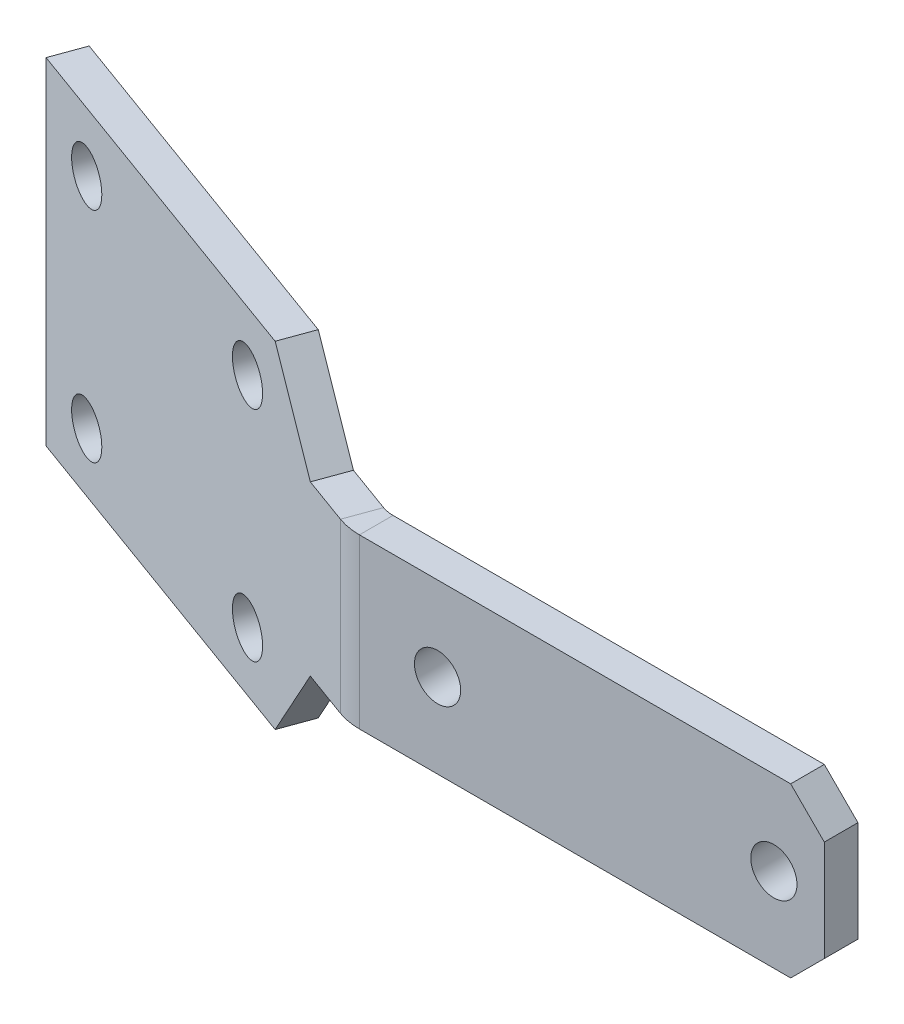
ISO-10303-21;
HEADER;
FILE_DESCRIPTION(('STEP AP214'),'2;1');
FILE_NAME('part.step','',(''),(''),'','','');
FILE_SCHEMA(('AUTOMOTIVE_DESIGN { 1 0 10303 214 1 1 1 1 }'));
ENDSEC;
DATA;
#1=APPLICATION_CONTEXT('core data for automotive mechanical design processes');
#2=APPLICATION_PROTOCOL_DEFINITION('international standard','automotive_design',2000,#1);
#3=PRODUCT_CONTEXT('',#1,'mechanical');
#4=PRODUCT('Part','Part','',(#3));
#5=PRODUCT_RELATED_PRODUCT_CATEGORY('part','',(#4));
#6=PRODUCT_DEFINITION_FORMATION('','',#4);
#7=PRODUCT_DEFINITION_CONTEXT('part definition',#1,'design');
#8=PRODUCT_DEFINITION('design','',#6,#7);
#9=PRODUCT_DEFINITION_SHAPE('','',#8);
#10=(LENGTH_UNIT() NAMED_UNIT(*) SI_UNIT(.MILLI.,.METRE.));
#11=(NAMED_UNIT(*) PLANE_ANGLE_UNIT() SI_UNIT($,.RADIAN.));
#12=(NAMED_UNIT(*) SI_UNIT($,.STERADIAN.) SOLID_ANGLE_UNIT());
#13=UNCERTAINTY_MEASURE_WITH_UNIT(LENGTH_MEASURE(1.E-05),#10,'distance_accuracy_value','');
#14=(GEOMETRIC_REPRESENTATION_CONTEXT(3) GLOBAL_UNCERTAINTY_ASSIGNED_CONTEXT((#13)) GLOBAL_UNIT_ASSIGNED_CONTEXT((#10,
#11,#12)) REPRESENTATION_CONTEXT('',''));
#15=CARTESIAN_POINT('',(0.,0.,0.));
#16=DIRECTION('',(0.,0.,1.));
#17=DIRECTION('',(1.,0.,0.));
#18=AXIS2_PLACEMENT_3D('',#15,#16,#17);
#19=CARTESIAN_POINT('',(-44.45,15.875,-6.35));
#20=DIRECTION('',(0.,1.,0.));
#21=DIRECTION('',(0.,0.,1.));
#22=AXIS2_PLACEMENT_3D('',#19,#20,#21);
#23=PLANE('',#22);
#24=DIRECTION('',(-1.,0.,0.));
#25=VECTOR('',#24,1.);
#26=CARTESIAN_POINT('',(-44.45,15.875,0.));
#27=LINE('',#26,#25);
#28=CARTESIAN_POINT('',(38.1,15.875,0.));
#29=VERTEX_POINT('',#28);
#30=CARTESIAN_POINT('',(-43.3303236725012,15.875,0.));
#31=VERTEX_POINT('',#30);
#32=EDGE_CURVE('E333',#29,#31,#27,.T.);
#33=ORIENTED_EDGE('',*,*,#32,.F.);
#34=DIRECTION('',(0.,0.,-1.));
#35=VECTOR('',#34,1.);
#36=CARTESIAN_POINT('',(38.1,15.875,-6.35));
#37=LINE('',#36,#35);
#38=CARTESIAN_POINT('',(38.1,15.875,-6.35));
#39=VERTEX_POINT('',#38);
#40=EDGE_CURVE('E64',#29,#39,#37,.T.);
#41=ORIENTED_EDGE('',*,*,#40,.T.);
#42=DIRECTION('',(-1.,0.,0.));
#43=VECTOR('',#42,1.);
#44=CARTESIAN_POINT('',(-44.45,15.875,-6.35));
#45=LINE('',#44,#43);
#46=CARTESIAN_POINT('',(-43.3303236725012,15.875,-6.35));
#47=VERTEX_POINT('',#46);
#48=EDGE_CURVE('E322',#39,#47,#45,.T.);
#49=ORIENTED_EDGE('',*,*,#48,.T.);
#50=DIRECTION('',(0.,0.,1.));
#51=VECTOR('',#50,1.);
#52=CARTESIAN_POINT('',(-43.3303236725012,15.875,-6.35));
#53=LINE('',#52,#51);
#54=EDGE_CURVE('E295',#47,#31,#53,.T.);
#55=ORIENTED_EDGE('',*,*,#54,.T.);
#56=EDGE_LOOP('',(#33,#41,#49,#55));
#57=FACE_BOUND('',#56,.T.);
#58=ADVANCED_FACE('F54',(#57),#23,.T.);
#59=CARTESIAN_POINT('',(0.,0.,-6.35));
#60=DIRECTION('',(0.,0.,-1.));
#61=DIRECTION('',(-1.,0.,0.));
#62=AXIS2_PLACEMENT_3D('',#59,#60,#61);
#63=PLANE('',#62);
#64=CARTESIAN_POINT('',(-28.575,0.,-6.35));
#65=DIRECTION('',(0.,0.,-1.));
#66=DIRECTION('',(-1.,0.,0.));
#67=AXIS2_PLACEMENT_3D('',#64,#65,#66);
#68=CIRCLE('',#67,4.365625);
#69=CARTESIAN_POINT('',(-32.940625,0.,-6.35));
#70=VERTEX_POINT('',#69);
#71=EDGE_CURVE('E344',#70,#70,#68,.T.);
#72=ORIENTED_EDGE('',*,*,#71,.F.);
#73=EDGE_LOOP('',(#72));
#74=FACE_BOUND('',#73,.T.);
#75=CARTESIAN_POINT('',(34.925,0.,-6.35));
#76=DIRECTION('',(0.,0.,-1.));
#77=DIRECTION('',(-1.,0.,0.));
#78=AXIS2_PLACEMENT_3D('',#75,#76,#77);
#79=CIRCLE('',#78,4.365625);
#80=CARTESIAN_POINT('',(30.559375,0.,-6.35));
#81=VERTEX_POINT('',#80);
#82=EDGE_CURVE('E501',#81,#81,#79,.T.);
#83=ORIENTED_EDGE('',*,*,#82,.F.);
#84=EDGE_LOOP('',(#83));
#85=FACE_BOUND('',#84,.T.);
#86=ORIENTED_EDGE('',*,*,#48,.F.);
#87=DIRECTION('',(-0.707106781186547,0.707106781186548,0.));
#88=VECTOR('',#87,1.);
#89=CARTESIAN_POINT('',(26.9875,26.9875,-6.35));
#90=LINE('',#89,#88);
#91=CARTESIAN_POINT('',(44.45,9.52499999999996,-6.35));
#92=VERTEX_POINT('',#91);
#93=EDGE_CURVE('E11',#39,#92,#90,.F.);
#94=ORIENTED_EDGE('',*,*,#93,.T.);
#95=DIRECTION('',(0.,1.,0.));
#96=VECTOR('',#95,1.);
#97=CARTESIAN_POINT('',(44.45,-15.875,-6.35));
#98=LINE('',#97,#96);
#99=CARTESIAN_POINT('',(44.45,-9.52499999999996,-6.35));
#100=VERTEX_POINT('',#99);
#101=EDGE_CURVE('E318',#100,#92,#98,.T.);
#102=ORIENTED_EDGE('',*,*,#101,.F.);
#103=DIRECTION('',(0.707106781186547,0.707106781186548,0.));
#104=VECTOR('',#103,1.);
#105=CARTESIAN_POINT('',(26.9875,-26.9875,-6.35));
#106=LINE('',#105,#104);
#107=CARTESIAN_POINT('',(38.1,-15.875,-6.35));
#108=VERTEX_POINT('',#107);
#109=EDGE_CURVE('E358',#100,#108,#106,.F.);
#110=ORIENTED_EDGE('',*,*,#109,.T.);
#111=DIRECTION('',(1.,0.,0.));
#112=VECTOR('',#111,1.);
#113=CARTESIAN_POINT('',(-44.45,-15.875,-6.35));
#114=LINE('',#113,#112);
#115=CARTESIAN_POINT('',(-43.3303236725012,-15.875,-6.35));
#116=VERTEX_POINT('',#115);
#117=EDGE_CURVE('E326',#116,#108,#114,.T.);
#118=ORIENTED_EDGE('',*,*,#117,.F.);
#119=DIRECTION('',(0.,1.,0.));
#120=VECTOR('',#119,1.);
#121=CARTESIAN_POINT('',(-43.3303236725012,15.875,-6.35));
#122=LINE('',#121,#120);
#123=EDGE_CURVE('E303',#47,#116,#122,.F.);
#124=ORIENTED_EDGE('',*,*,#123,.F.);
#125=EDGE_LOOP('',(#86,#94,#102,#110,#118,#124));
#126=FACE_BOUND('',#125,.T.);
#127=ADVANCED_FACE('F570',(#74,#85,#126),#63,.T.);
#128=CARTESIAN_POINT('',(0.,0.,0.));
#129=DIRECTION('',(0.,0.,-1.));
#130=DIRECTION('',(-1.,0.,0.));
#131=AXIS2_PLACEMENT_3D('',#128,#129,#130);
#132=PLANE('',#131);
#133=CARTESIAN_POINT('',(-28.575,0.,0.));
#134=DIRECTION('',(0.,0.,-1.));
#135=DIRECTION('',(-1.,0.,0.));
#136=AXIS2_PLACEMENT_3D('',#133,#134,#135);
#137=CIRCLE('',#136,4.365625);
#138=CARTESIAN_POINT('',(-32.940625,0.,0.));
#139=VERTEX_POINT('',#138);
#140=EDGE_CURVE('E343',#139,#139,#137,.T.);
#141=ORIENTED_EDGE('',*,*,#140,.T.);
#142=EDGE_LOOP('',(#141));
#143=FACE_BOUND('',#142,.T.);
#144=CARTESIAN_POINT('',(34.925,0.,0.));
#145=DIRECTION('',(0.,0.,-1.));
#146=DIRECTION('',(-1.,0.,0.));
#147=AXIS2_PLACEMENT_3D('',#144,#145,#146);
#148=CIRCLE('',#147,4.365625);
#149=CARTESIAN_POINT('',(30.559375,0.,0.));
#150=VERTEX_POINT('',#149);
#151=EDGE_CURVE('E339',#150,#150,#148,.T.);
#152=ORIENTED_EDGE('',*,*,#151,.T.);
#153=EDGE_LOOP('',(#152));
#154=FACE_BOUND('',#153,.T.);
#155=DIRECTION('',(0.,1.,0.));
#156=VECTOR('',#155,1.);
#157=CARTESIAN_POINT('',(44.45,-15.875,0.));
#158=LINE('',#157,#156);
#159=CARTESIAN_POINT('',(44.45,-9.52499999999996,0.));
#160=VERTEX_POINT('',#159);
#161=CARTESIAN_POINT('',(44.45,9.52499999999996,0.));
#162=VERTEX_POINT('',#161);
#163=EDGE_CURVE('E314',#160,#162,#158,.T.);
#164=ORIENTED_EDGE('',*,*,#163,.T.);
#165=DIRECTION('',(0.707106781186547,-0.707106781186548,0.));
#166=VECTOR('',#165,1.);
#167=CARTESIAN_POINT('',(44.45,9.52499999999996,0.));
#168=LINE('',#167,#166);
#169=EDGE_CURVE('E82',#162,#29,#168,.F.);
#170=ORIENTED_EDGE('',*,*,#169,.T.);
#171=ORIENTED_EDGE('',*,*,#32,.T.);
#172=DIRECTION('',(0.,1.,0.));
#173=VECTOR('',#172,1.);
#174=CARTESIAN_POINT('',(-43.3303236725012,15.875,0.));
#175=LINE('',#174,#173);
#176=CARTESIAN_POINT('',(-43.3303236725012,-15.875,0.));
#177=VERTEX_POINT('',#176);
#178=EDGE_CURVE('E287',#31,#177,#175,.F.);
#179=ORIENTED_EDGE('',*,*,#178,.T.);
#180=DIRECTION('',(1.,0.,0.));
#181=VECTOR('',#180,1.);
#182=CARTESIAN_POINT('',(-44.45,-15.875,0.));
#183=LINE('',#182,#181);
#184=CARTESIAN_POINT('',(38.1,-15.875,0.));
#185=VERTEX_POINT('',#184);
#186=EDGE_CURVE('E323',#177,#185,#183,.T.);
#187=ORIENTED_EDGE('',*,*,#186,.T.);
#188=DIRECTION('',(-0.707106781186547,-0.707106781186548,0.));
#189=VECTOR('',#188,1.);
#190=CARTESIAN_POINT('',(38.1,-15.875,0.));
#191=LINE('',#190,#189);
#192=EDGE_CURVE('E352',#185,#160,#191,.F.);
#193=ORIENTED_EDGE('',*,*,#192,.T.);
#194=EDGE_LOOP('',(#164,#170,#171,#179,#187,#193));
#195=FACE_BOUND('',#194,.T.);
#196=ADVANCED_FACE('F600',(#143,#154,#195),#132,.F.);
#197=CARTESIAN_POINT('',(44.45,-15.875,-6.35));
#198=DIRECTION('',(1.,0.,0.));
#199=DIRECTION('',(0.,0.,-1.));
#200=AXIS2_PLACEMENT_3D('',#197,#198,#199);
#201=PLANE('',#200);
#202=ORIENTED_EDGE('',*,*,#101,.T.);
#203=DIRECTION('',(0.,0.,1.));
#204=VECTOR('',#203,1.);
#205=CARTESIAN_POINT('',(44.45,9.52499999999996,-6.35));
#206=LINE('',#205,#204);
#207=EDGE_CURVE('E361',#92,#162,#206,.T.);
#208=ORIENTED_EDGE('',*,*,#207,.T.);
#209=ORIENTED_EDGE('',*,*,#163,.F.);
#210=DIRECTION('',(0.,0.,-1.));
#211=VECTOR('',#210,1.);
#212=CARTESIAN_POINT('',(44.45,-9.52499999999996,-6.35));
#213=LINE('',#212,#211);
#214=EDGE_CURVE('E355',#160,#100,#213,.T.);
#215=ORIENTED_EDGE('',*,*,#214,.T.);
#216=EDGE_LOOP('',(#202,#208,#209,#215));
#217=FACE_BOUND('',#216,.T.);
#218=ADVANCED_FACE('F606',(#217),#201,.T.);
#219=CARTESIAN_POINT('',(-44.45,-15.875,-6.35));
#220=DIRECTION('',(0.,-1.,0.));
#221=DIRECTION('',(0.,0.,-1.));
#222=AXIS2_PLACEMENT_3D('',#219,#220,#221);
#223=PLANE('',#222);
#224=ORIENTED_EDGE('',*,*,#117,.T.);
#225=DIRECTION('',(0.,0.,1.));
#226=VECTOR('',#225,1.);
#227=CARTESIAN_POINT('',(38.1,-15.875,-6.35));
#228=LINE('',#227,#226);
#229=EDGE_CURVE('E330',#108,#185,#228,.T.);
#230=ORIENTED_EDGE('',*,*,#229,.T.);
#231=ORIENTED_EDGE('',*,*,#186,.F.);
#232=DIRECTION('',(0.,0.,1.));
#233=VECTOR('',#232,1.);
#234=CARTESIAN_POINT('',(-43.3303236725012,-15.875,-6.35));
#235=LINE('',#234,#233);
#236=EDGE_CURVE('E310',#116,#177,#235,.T.);
#237=ORIENTED_EDGE('',*,*,#236,.F.);
#238=EDGE_LOOP('',(#224,#230,#231,#237));
#239=FACE_BOUND('',#238,.T.);
#240=ADVANCED_FACE('F566',(#239),#223,.T.);
#241=CARTESIAN_POINT('',(-43.3303236725012,-15.875,-12.7));
#242=DIRECTION('',(0.,-1.,0.));
#243=DIRECTION('',(0.,0.,-1.));
#244=AXIS2_PLACEMENT_3D('',#241,#242,#243);
#245=PLANE('',#244);
#246=DIRECTION('',(-0.342020143325663,0.,0.93969262078591));
#247=VECTOR('',#246,1.);
#248=CARTESIAN_POINT('',(-45.5021515826192,-15.875,-6.73295185800947));
#249=LINE('',#248,#247);
#250=CARTESIAN_POINT('',(-45.5021515826192,-15.875,-6.73295185800947));
#251=VERTEX_POINT('',#250);
#252=CARTESIAN_POINT('',(-47.6739794927372,-15.875,-0.76590371601894));
#253=VERTEX_POINT('',#252);
#254=EDGE_CURVE('E252',#251,#253,#249,.T.);
#255=ORIENTED_EDGE('',*,*,#254,.F.);
#256=CARTESIAN_POINT('',(-43.3303236725012,-15.875,-12.7));
#257=DIRECTION('',(0.,1.,0.));
#258=DIRECTION('',(0.,0.,1.));
#259=AXIS2_PLACEMENT_3D('',#256,#257,#258);
#260=CIRCLE('',#259,6.35000000000004);
#261=EDGE_CURVE('E299',#116,#251,#260,.F.);
#262=ORIENTED_EDGE('',*,*,#261,.F.);
#263=ORIENTED_EDGE('',*,*,#236,.T.);
#264=CARTESIAN_POINT('',(-43.3303236725012,-15.875,-12.7));
#265=DIRECTION('',(0.,1.,0.));
#266=DIRECTION('',(0.,0.,1.));
#267=AXIS2_PLACEMENT_3D('',#264,#265,#266);
#268=CIRCLE('',#267,12.7);
#269=EDGE_CURVE('E290',#177,#253,#268,.F.);
#270=ORIENTED_EDGE('',*,*,#269,.T.);
#271=EDGE_LOOP('',(#255,#262,#263,#270));
#272=FACE_BOUND('',#271,.T.);
#273=ADVANCED_FACE('F561',(#272),#245,.T.);
#274=CARTESIAN_POINT('',(-43.3303236725012,15.875,-12.7));
#275=DIRECTION('',(0.,-1.,0.));
#276=DIRECTION('',(0.,0.,-1.));
#277=AXIS2_PLACEMENT_3D('',#274,#275,#276);
#278=PLANE('',#277);
#279=CARTESIAN_POINT('',(-43.3303236725012,15.875,-12.7));
#280=DIRECTION('',(0.,1.,0.));
#281=DIRECTION('',(0.,0.,1.));
#282=AXIS2_PLACEMENT_3D('',#279,#280,#281);
#283=CIRCLE('',#282,6.35000000000004);
#284=CARTESIAN_POINT('',(-45.5021515826192,15.875,-6.73295185800947));
#285=VERTEX_POINT('',#284);
#286=EDGE_CURVE('E279',#285,#47,#283,.T.);
#287=ORIENTED_EDGE('',*,*,#286,.F.);
#288=DIRECTION('',(-0.342020143325663,0.,0.93969262078591));
#289=VECTOR('',#288,1.);
#290=CARTESIAN_POINT('',(-45.5021515826192,15.875,-6.73295185800947));
#291=LINE('',#290,#289);
#292=CARTESIAN_POINT('',(-47.6739794927372,15.875,-0.765903716018942));
#293=VERTEX_POINT('',#292);
#294=EDGE_CURVE('E262',#285,#293,#291,.T.);
#295=ORIENTED_EDGE('',*,*,#294,.T.);
#296=CARTESIAN_POINT('',(-43.3303236725012,15.875,-12.7));
#297=DIRECTION('',(0.,1.,0.));
#298=DIRECTION('',(0.,0.,1.));
#299=AXIS2_PLACEMENT_3D('',#296,#297,#298);
#300=CIRCLE('',#299,12.7);
#301=EDGE_CURVE('E291',#293,#31,#300,.T.);
#302=ORIENTED_EDGE('',*,*,#301,.T.);
#303=ORIENTED_EDGE('',*,*,#54,.F.);
#304=EDGE_LOOP('',(#287,#295,#302,#303));
#305=FACE_BOUND('',#304,.T.);
#306=ADVANCED_FACE('F577',(#305),#278,.F.);
#307=CARTESIAN_POINT('',(-43.3303236725012,15.875,-12.7));
#308=DIRECTION('',(0.,1.,0.));
#309=DIRECTION('',(-0.342020143325663,0.,0.939692620785911));
#310=AXIS2_PLACEMENT_3D('',#307,#308,#309);
#311=CYLINDRICAL_SURFACE('',#310,12.7);
#312=ORIENTED_EDGE('',*,*,#178,.F.);
#313=ORIENTED_EDGE('',*,*,#301,.F.);
#314=DIRECTION('',(0.,1.,0.));
#315=VECTOR('',#314,1.);
#316=CARTESIAN_POINT('',(-47.6739794927372,0.,-0.765903716018939));
#317=LINE('',#316,#315);
#318=EDGE_CURVE('E266',#253,#293,#317,.T.);
#319=ORIENTED_EDGE('',*,*,#318,.F.);
#320=ORIENTED_EDGE('',*,*,#269,.F.);
#321=EDGE_LOOP('',(#312,#313,#319,#320));
#322=FACE_BOUND('',#321,.T.);
#323=ADVANCED_FACE('F559',(#322),#311,.T.);
#324=CARTESIAN_POINT('',(-43.3303236725012,15.875,-12.7));
#325=DIRECTION('',(0.,1.,0.));
#326=DIRECTION('',(-0.342020143325663,0.,0.939692620785911));
#327=AXIS2_PLACEMENT_3D('',#324,#325,#326);
#328=CYLINDRICAL_SURFACE('',#327,6.35000000000004);
#329=ORIENTED_EDGE('',*,*,#123,.T.);
#330=ORIENTED_EDGE('',*,*,#261,.T.);
#331=DIRECTION('',(0.,1.,0.));
#332=VECTOR('',#331,1.);
#333=CARTESIAN_POINT('',(-45.5021515826192,-15.875,-6.73295185800947));
#334=LINE('',#333,#332);
#335=EDGE_CURVE('E258',#251,#285,#334,.T.);
#336=ORIENTED_EDGE('',*,*,#335,.T.);
#337=ORIENTED_EDGE('',*,*,#286,.T.);
#338=EDGE_LOOP('',(#329,#330,#336,#337));
#339=FACE_BOUND('',#338,.T.);
#340=ADVANCED_FACE('F574',(#339),#328,.F.);
#341=CARTESIAN_POINT('',(-46.621827910118,15.875,-0.382951858009469));
#342=DIRECTION('',(0.,1.,0.));
#343=DIRECTION('',(0.,0.,1.));
#344=AXIS2_PLACEMENT_3D('',#341,#342,#343);
#345=PLANE('',#344);
#346=DIRECTION('',(0.342020143325663,0.,-0.93969262078591));
#347=VECTOR('',#346,1.);
#348=CARTESIAN_POINT('',(-56.624551705723,15.875,-4.02364558119587));
#349=LINE('',#348,#347);
#350=CARTESIAN_POINT('',(-56.624551705723,15.875,-4.02364558119587));
#351=VERTEX_POINT('',#350);
#352=CARTESIAN_POINT('',(-54.452723795605,15.875,-9.99069372318641));
#353=VERTEX_POINT('',#352);
#354=EDGE_CURVE('E249',#351,#353,#349,.T.);
#355=ORIENTED_EDGE('',*,*,#354,.F.);
#356=DIRECTION('',(0.939692620785911,0.,0.342020143325663));
#357=VECTOR('',#356,1.);
#358=CARTESIAN_POINT('',(-46.621827910118,15.875,-0.382951858009469));
#359=LINE('',#358,#357);
#360=EDGE_CURVE('E198',#351,#293,#359,.T.);
#361=ORIENTED_EDGE('',*,*,#360,.T.);
#362=ORIENTED_EDGE('',*,*,#294,.F.);
#363=DIRECTION('',(0.939692620785911,0.,0.342020143325663));
#364=VECTOR('',#363,1.);
#365=CARTESIAN_POINT('',(-44.45,15.875,-6.35));
#366=LINE('',#365,#364);
#367=EDGE_CURVE('E275',#353,#285,#366,.T.);
#368=ORIENTED_EDGE('',*,*,#367,.F.);
#369=EDGE_LOOP('',(#355,#361,#362,#368));
#370=FACE_BOUND('',#369,.T.);
#371=ADVANCED_FACE('F580',(#370),#345,.T.);
#372=CARTESIAN_POINT('',(-135.075398457357,-15.875,-32.5774186517694));
#373=DIRECTION('',(0.,-1.,0.));
#374=DIRECTION('',(1.,0.,0.));
#375=AXIS2_PLACEMENT_3D('',#372,#373,#374);
#376=PLANE('',#375);
#377=DIRECTION('',(0.342020143325663,0.,-0.93969262078591));
#378=VECTOR('',#377,1.);
#379=CARTESIAN_POINT('',(-56.624551705723,-15.875,-4.02364558119587));
#380=LINE('',#379,#378);
#381=CARTESIAN_POINT('',(-56.6245517057229,-15.875,-4.02364558119586));
#382=VERTEX_POINT('',#381);
#383=CARTESIAN_POINT('',(-54.452723795605,-15.875,-9.99069372318641));
#384=VERTEX_POINT('',#383);
#385=EDGE_CURVE('E209',#382,#384,#380,.T.);
#386=ORIENTED_EDGE('',*,*,#385,.T.);
#387=DIRECTION('',(-0.939692620785911,0.,-0.342020143325663));
#388=VECTOR('',#387,1.);
#389=CARTESIAN_POINT('',(-132.903570547239,-15.875,-38.5444667937599));
#390=LINE('',#389,#388);
#391=EDGE_CURVE('E273',#251,#384,#390,.T.);
#392=ORIENTED_EDGE('',*,*,#391,.F.);
#393=ORIENTED_EDGE('',*,*,#254,.T.);
#394=DIRECTION('',(-0.939692620785911,0.,-0.342020143325663));
#395=VECTOR('',#394,1.);
#396=CARTESIAN_POINT('',(-135.075398457357,-15.875,-32.5774186517694));
#397=LINE('',#396,#395);
#398=EDGE_CURVE('E199',#253,#382,#397,.T.);
#399=ORIENTED_EDGE('',*,*,#398,.T.);
#400=EDGE_LOOP('',(#386,#392,#393,#399));
#401=FACE_BOUND('',#400,.T.);
#402=ADVANCED_FACE('F526',(#401),#376,.T.);
#403=CARTESIAN_POINT('',(-5.33063950104377,0.,14.6458116603709));
#404=DIRECTION('',(-0.342020143325663,0.,0.939692620785911));
#405=DIRECTION('',(0.939692620785911,0.,0.342020143325663));
#406=AXIS2_PLACEMENT_3D('',#403,#404,#405);
#407=PLANE('',#406);
#408=CARTESIAN_POINT('',(-75.2670545715714,20.6375,-10.8089617165869));
#409=DIRECTION('',(-0.342020143325663,0.,0.939692620785911));
#410=DIRECTION('',(0.939692620785911,0.,0.342020143325663));
#411=AXIS2_PLACEMENT_3D('',#408,#409,#410);
#412=CIRCLE('',#411,4.76249999999997);
#413=CARTESIAN_POINT('',(-70.7917684650785,20.6375,-9.18009078399848));
#414=VERTEX_POINT('',#413);
#415=EDGE_CURVE('E226',#414,#414,#412,.T.);
#416=ORIENTED_EDGE('',*,*,#415,.F.);
#417=EDGE_LOOP('',(#416));
#418=FACE_BOUND('',#417,.T.);
#419=CARTESIAN_POINT('',(-123.003439707496,20.6375,-28.1835849975306));
#420=DIRECTION('',(-0.342020143325663,0.,0.939692620785911));
#421=DIRECTION('',(0.939692620785911,0.,0.342020143325663));
#422=AXIS2_PLACEMENT_3D('',#419,#420,#421);
#423=CIRCLE('',#422,4.76249999999998);
#424=CARTESIAN_POINT('',(-118.528153601003,20.6375,-26.5547140649422));
#425=VERTEX_POINT('',#424);
#426=EDGE_CURVE('E510',#425,#425,#423,.T.);
#427=ORIENTED_EDGE('',*,*,#426,.F.);
#428=EDGE_LOOP('',(#427));
#429=FACE_BOUND('',#428,.T.);
#430=CARTESIAN_POINT('',(-123.003439707496,-20.6375,-28.1835849975306));
#431=DIRECTION('',(-0.342020143325663,0.,0.939692620785911));
#432=DIRECTION('',(0.939692620785911,0.,0.342020143325663));
#433=AXIS2_PLACEMENT_3D('',#430,#431,#432);
#434=CIRCLE('',#433,4.76249999999998);
#435=CARTESIAN_POINT('',(-118.528153601003,-20.6375,-26.5547140649422));
#436=VERTEX_POINT('',#435);
#437=EDGE_CURVE('E472',#436,#436,#434,.T.);
#438=ORIENTED_EDGE('',*,*,#437,.F.);
#439=EDGE_LOOP('',(#438));
#440=FACE_BOUND('',#439,.T.);
#441=CARTESIAN_POINT('',(-75.2670545715714,-20.6375,-10.8089617165869));
#442=DIRECTION('',(-0.342020143325663,0.,0.939692620785911));
#443=DIRECTION('',(0.939692620785911,0.,0.342020143325663));
#444=AXIS2_PLACEMENT_3D('',#441,#442,#443);
#445=CIRCLE('',#444,4.7625);
#446=CARTESIAN_POINT('',(-70.7917684650785,-20.6375,-9.18009078399847));
#447=VERTEX_POINT('',#446);
#448=EDGE_CURVE('E469',#447,#447,#445,.T.);
#449=ORIENTED_EDGE('',*,*,#448,.F.);
#450=EDGE_LOOP('',(#449));
#451=FACE_BOUND('',#450,.T.);
#452=ORIENTED_EDGE('',*,*,#398,.F.);
#453=ORIENTED_EDGE('',*,*,#318,.T.);
#454=ORIENTED_EDGE('',*,*,#360,.F.);
#455=DIRECTION('',(0.538985544695761,-0.819152044288989,0.196174694969009));
#456=VECTOR('',#455,1.);
#457=CARTESIAN_POINT('',(-56.624551705723,15.875,-4.02364558119587));
#458=LINE('',#457,#456);
#459=CARTESIAN_POINT('',(-67.0699819304281,31.75,-7.825471267093));
#460=VERTEX_POINT('',#459);
#461=EDGE_CURVE('E238',#460,#351,#458,.T.);
#462=ORIENTED_EDGE('',*,*,#461,.F.);
#463=DIRECTION('',(0.939692620785911,0.,0.342020143325663));
#464=VECTOR('',#463,1.);
#465=CARTESIAN_POINT('',(-67.0699819304281,31.75,-7.825471267093));
#466=LINE('',#465,#464);
#467=CARTESIAN_POINT('',(-135.075398457357,31.75,-32.5774186517694));
#468=VERTEX_POINT('',#467);
#469=EDGE_CURVE('E193',#468,#460,#466,.T.);
#470=ORIENTED_EDGE('',*,*,#469,.F.);
#471=DIRECTION('',(0.,1.,0.));
#472=VECTOR('',#471,1.);
#473=CARTESIAN_POINT('',(-135.075398457357,15.875,-32.5774186517694));
#474=LINE('',#473,#472);
#475=CARTESIAN_POINT('',(-135.075398457357,-31.75,-32.5774186517694));
#476=VERTEX_POINT('',#475);
#477=EDGE_CURVE('E183',#476,#468,#474,.T.);
#478=ORIENTED_EDGE('',*,*,#477,.F.);
#479=DIRECTION('',(-0.939692620785911,0.,-0.342020143325663));
#480=VECTOR('',#479,1.);
#481=CARTESIAN_POINT('',(-67.0699819304281,-31.75,-7.825471267093));
#482=LINE('',#481,#480);
#483=CARTESIAN_POINT('',(-67.0699819304281,-31.75,-7.825471267093));
#484=VERTEX_POINT('',#483);
#485=EDGE_CURVE('E189',#484,#476,#482,.T.);
#486=ORIENTED_EDGE('',*,*,#485,.F.);
#487=DIRECTION('',(-0.538985544695761,-0.819152044288989,-0.196174694969009));
#488=VECTOR('',#487,1.);
#489=CARTESIAN_POINT('',(-56.624551705723,-15.875,-4.02364558119587));
#490=LINE('',#489,#488);
#491=EDGE_CURVE('E210',#382,#484,#490,.T.);
#492=ORIENTED_EDGE('',*,*,#491,.F.);
#493=EDGE_LOOP('',(#452,#453,#454,#462,#470,#478,#486,#492));
#494=FACE_BOUND('',#493,.T.);
#495=ADVANCED_FACE('F186',(#418,#429,#440,#451,#494),#407,.T.);
#496=CARTESIAN_POINT('',(-3.15881159092581,0.,8.67876351838035));
#497=DIRECTION('',(-0.342020143325663,0.,0.939692620785911));
#498=DIRECTION('',(0.939692620785911,0.,0.342020143325663));
#499=AXIS2_PLACEMENT_3D('',#496,#497,#498);
#500=PLANE('',#499);
#501=CARTESIAN_POINT('',(-73.0952266614534,20.6375,-16.7760098585775));
#502=DIRECTION('',(0.342020143325663,0.,-0.93969262078591));
#503=DIRECTION('',(-0.93969262078591,0.,-0.342020143325663));
#504=AXIS2_PLACEMENT_3D('',#501,#502,#503);
#505=CIRCLE('',#504,4.76249999999997);
#506=CARTESIAN_POINT('',(-77.5705127679463,20.6375,-18.4048807911659));
#507=VERTEX_POINT('',#506);
#508=EDGE_CURVE('E348',#507,#507,#505,.T.);
#509=ORIENTED_EDGE('',*,*,#508,.F.);
#510=EDGE_LOOP('',(#509));
#511=FACE_BOUND('',#510,.T.);
#512=CARTESIAN_POINT('',(-120.831611797378,20.6375,-34.1506331395212));
#513=DIRECTION('',(0.342020143325663,0.,-0.93969262078591));
#514=DIRECTION('',(-0.93969262078591,0.,-0.342020143325663));
#515=AXIS2_PLACEMENT_3D('',#512,#513,#514);
#516=CIRCLE('',#515,4.76249999999998);
#517=CARTESIAN_POINT('',(-125.306897903871,20.6375,-35.7795040721096));
#518=VERTEX_POINT('',#517);
#519=EDGE_CURVE('E486',#518,#518,#516,.T.);
#520=ORIENTED_EDGE('',*,*,#519,.F.);
#521=EDGE_LOOP('',(#520));
#522=FACE_BOUND('',#521,.T.);
#523=CARTESIAN_POINT('',(-120.831611797378,-20.6375,-34.1506331395212));
#524=DIRECTION('',(0.342020143325663,0.,-0.93969262078591));
#525=DIRECTION('',(-0.93969262078591,0.,-0.342020143325663));
#526=AXIS2_PLACEMENT_3D('',#523,#524,#525);
#527=CIRCLE('',#526,4.76249999999998);
#528=CARTESIAN_POINT('',(-125.306897903871,-20.6375,-35.7795040721096));
#529=VERTEX_POINT('',#528);
#530=EDGE_CURVE('E481',#529,#529,#527,.T.);
#531=ORIENTED_EDGE('',*,*,#530,.F.);
#532=EDGE_LOOP('',(#531));
#533=FACE_BOUND('',#532,.T.);
#534=CARTESIAN_POINT('',(-73.0952266614534,-20.6375,-16.7760098585775));
#535=DIRECTION('',(0.342020143325663,0.,-0.93969262078591));
#536=DIRECTION('',(-0.93969262078591,0.,-0.342020143325663));
#537=AXIS2_PLACEMENT_3D('',#534,#535,#536);
#538=CIRCLE('',#537,4.7625);
#539=CARTESIAN_POINT('',(-77.5705127679463,-20.6375,-18.404880791166));
#540=VERTEX_POINT('',#539);
#541=EDGE_CURVE('E467',#540,#540,#538,.T.);
#542=ORIENTED_EDGE('',*,*,#541,.F.);
#543=EDGE_LOOP('',(#542));
#544=FACE_BOUND('',#543,.T.);
#545=ORIENTED_EDGE('',*,*,#335,.F.);
#546=ORIENTED_EDGE('',*,*,#391,.T.);
#547=DIRECTION('',(-0.538985544695761,-0.819152044288989,-0.196174694969009));
#548=VECTOR('',#547,1.);
#549=CARTESIAN_POINT('',(-54.452723795605,-15.875,-9.99069372318641));
#550=LINE('',#549,#548);
#551=CARTESIAN_POINT('',(-64.8981540203102,-31.75,-13.7925194090835));
#552=VERTEX_POINT('',#551);
#553=EDGE_CURVE('E215',#384,#552,#550,.T.);
#554=ORIENTED_EDGE('',*,*,#553,.T.);
#555=DIRECTION('',(-0.939692620785911,0.,-0.342020143325663));
#556=VECTOR('',#555,1.);
#557=CARTESIAN_POINT('',(-64.8981540203102,-31.75,-13.7925194090835));
#558=LINE('',#557,#556);
#559=CARTESIAN_POINT('',(-132.903570547239,-31.75,-38.5444667937599));
#560=VERTEX_POINT('',#559);
#561=EDGE_CURVE('E223',#552,#560,#558,.T.);
#562=ORIENTED_EDGE('',*,*,#561,.T.);
#563=DIRECTION('',(0.,1.,0.));
#564=VECTOR('',#563,1.);
#565=CARTESIAN_POINT('',(-132.903570547239,15.875,-38.5444667937599));
#566=LINE('',#565,#564);
#567=CARTESIAN_POINT('',(-132.903570547239,31.75,-38.5444667937599));
#568=VERTEX_POINT('',#567);
#569=EDGE_CURVE('E204',#560,#568,#566,.T.);
#570=ORIENTED_EDGE('',*,*,#569,.T.);
#571=DIRECTION('',(0.939692620785911,0.,0.342020143325663));
#572=VECTOR('',#571,1.);
#573=CARTESIAN_POINT('',(-64.8981540203102,31.75,-13.7925194090835));
#574=LINE('',#573,#572);
#575=CARTESIAN_POINT('',(-64.8981540203102,31.75,-13.7925194090835));
#576=VERTEX_POINT('',#575);
#577=EDGE_CURVE('E233',#568,#576,#574,.T.);
#578=ORIENTED_EDGE('',*,*,#577,.T.);
#579=DIRECTION('',(0.538985544695761,-0.819152044288989,0.196174694969009));
#580=VECTOR('',#579,1.);
#581=CARTESIAN_POINT('',(-54.452723795605,15.875,-9.99069372318641));
#582=LINE('',#581,#580);
#583=EDGE_CURVE('E239',#576,#353,#582,.T.);
#584=ORIENTED_EDGE('',*,*,#583,.T.);
#585=ORIENTED_EDGE('',*,*,#367,.T.);
#586=EDGE_LOOP('',(#545,#546,#554,#562,#570,#578,#584,#585));
#587=FACE_BOUND('',#586,.T.);
#588=ADVANCED_FACE('F525',(#511,#522,#533,#544,#587),#500,.F.);
#589=CARTESIAN_POINT('',(-135.075398457357,15.875,-32.5774186517694));
#590=DIRECTION('',(-0.93969262078591,0.,-0.342020143325663));
#591=DIRECTION('',(-0.342020143325663,0.,0.939692620785911));
#592=AXIS2_PLACEMENT_3D('',#589,#590,#591);
#593=PLANE('',#592);
#594=ORIENTED_EDGE('',*,*,#569,.F.);
#595=DIRECTION('',(0.342020143325663,0.,-0.93969262078591));
#596=VECTOR('',#595,1.);
#597=CARTESIAN_POINT('',(-135.075398457357,-31.75,-32.5774186517694));
#598=LINE('',#597,#596);
#599=EDGE_CURVE('E202',#476,#560,#598,.T.);
#600=ORIENTED_EDGE('',*,*,#599,.F.);
#601=ORIENTED_EDGE('',*,*,#477,.T.);
#602=DIRECTION('',(0.342020143325663,0.,-0.93969262078591));
#603=VECTOR('',#602,1.);
#604=CARTESIAN_POINT('',(-135.075398457357,31.75,-32.5774186517694));
#605=LINE('',#604,#603);
#606=EDGE_CURVE('E242',#468,#568,#605,.T.);
#607=ORIENTED_EDGE('',*,*,#606,.T.);
#608=EDGE_LOOP('',(#594,#600,#601,#607));
#609=FACE_BOUND('',#608,.T.);
#610=ADVANCED_FACE('F203',(#609),#593,.T.);
#611=CARTESIAN_POINT('',(-56.624551705723,15.875,-4.02364558119587));
#612=DIRECTION('',(0.769751131320056,0.57357643635105,0.28016649959323));
#613=DIRECTION('',(-0.597505689595561,0.801864671188931,0.));
#614=AXIS2_PLACEMENT_3D('',#611,#612,#613);
#615=PLANE('',#614);
#616=ORIENTED_EDGE('',*,*,#583,.F.);
#617=DIRECTION('',(0.342020143325663,0.,-0.93969262078591));
#618=VECTOR('',#617,1.);
#619=CARTESIAN_POINT('',(-67.0699819304281,31.75,-7.825471267093));
#620=LINE('',#619,#618);
#621=EDGE_CURVE('E253',#460,#576,#620,.T.);
#622=ORIENTED_EDGE('',*,*,#621,.F.);
#623=ORIENTED_EDGE('',*,*,#461,.T.);
#624=ORIENTED_EDGE('',*,*,#354,.T.);
#625=EDGE_LOOP('',(#616,#622,#623,#624));
#626=FACE_BOUND('',#625,.T.);
#627=ADVANCED_FACE('F583',(#626),#615,.T.);
#628=CARTESIAN_POINT('',(-67.0699819304281,31.75,-7.825471267093));
#629=DIRECTION('',(0.,1.,0.));
#630=DIRECTION('',(0.,0.,1.));
#631=AXIS2_PLACEMENT_3D('',#628,#629,#630);
#632=PLANE('',#631);
#633=ORIENTED_EDGE('',*,*,#577,.F.);
#634=ORIENTED_EDGE('',*,*,#606,.F.);
#635=ORIENTED_EDGE('',*,*,#469,.T.);
#636=ORIENTED_EDGE('',*,*,#621,.T.);
#637=EDGE_LOOP('',(#633,#634,#635,#636));
#638=FACE_BOUND('',#637,.T.);
#639=ADVANCED_FACE('F586',(#638),#632,.T.);
#640=CARTESIAN_POINT('',(-67.0699819304281,-31.75,-7.825471267093));
#641=DIRECTION('',(0.,-1.,0.));
#642=DIRECTION('',(0.,0.,-1.));
#643=AXIS2_PLACEMENT_3D('',#640,#641,#642);
#644=PLANE('',#643);
#645=ORIENTED_EDGE('',*,*,#561,.F.);
#646=DIRECTION('',(0.342020143325663,0.,-0.93969262078591));
#647=VECTOR('',#646,1.);
#648=CARTESIAN_POINT('',(-67.0699819304281,-31.75,-7.825471267093));
#649=LINE('',#648,#647);
#650=EDGE_CURVE('E213',#484,#552,#649,.T.);
#651=ORIENTED_EDGE('',*,*,#650,.F.);
#652=ORIENTED_EDGE('',*,*,#485,.T.);
#653=ORIENTED_EDGE('',*,*,#599,.T.);
#654=EDGE_LOOP('',(#645,#651,#652,#653));
#655=FACE_BOUND('',#654,.T.);
#656=ADVANCED_FACE('F212',(#655),#644,.T.);
#657=CARTESIAN_POINT('',(-56.624551705723,-15.875,-4.02364558119587));
#658=DIRECTION('',(0.769751131320056,-0.57357643635105,0.28016649959323));
#659=DIRECTION('',(0.597505689595561,0.801864671188931,0.));
#660=AXIS2_PLACEMENT_3D('',#657,#658,#659);
#661=PLANE('',#660);
#662=ORIENTED_EDGE('',*,*,#553,.F.);
#663=ORIENTED_EDGE('',*,*,#385,.F.);
#664=ORIENTED_EDGE('',*,*,#491,.T.);
#665=ORIENTED_EDGE('',*,*,#650,.T.);
#666=EDGE_LOOP('',(#662,#663,#664,#665));
#667=FACE_BOUND('',#666,.T.);
#668=ADVANCED_FACE('F537',(#667),#661,.T.);
#669=CARTESIAN_POINT('',(-86.1261941221612,-20.6375,19.0262789933657));
#670=DIRECTION('',(0.342020143325663,0.,-0.93969262078591));
#671=DIRECTION('',(-0.93969262078591,0.,-0.342020143325663));
#672=AXIS2_PLACEMENT_3D('',#669,#670,#671);
#673=CYLINDRICAL_SURFACE('',#672,4.7625);
#674=ORIENTED_EDGE('',*,*,#448,.T.);
#675=EDGE_LOOP('',(#674));
#676=FACE_BOUND('',#675,.T.);
#677=ORIENTED_EDGE('',*,*,#541,.T.);
#678=EDGE_LOOP('',(#677));
#679=FACE_BOUND('',#678,.T.);
#680=ADVANCED_FACE('F533',(#676,#679),#673,.F.);
#681=CARTESIAN_POINT('',(-133.862579258085,-20.6375,1.65165571242202));
#682=DIRECTION('',(0.342020143325663,0.,-0.93969262078591));
#683=DIRECTION('',(-0.93969262078591,0.,-0.342020143325663));
#684=AXIS2_PLACEMENT_3D('',#681,#682,#683);
#685=CYLINDRICAL_SURFACE('',#684,4.76249999999998);
#686=ORIENTED_EDGE('',*,*,#437,.T.);
#687=EDGE_LOOP('',(#686));
#688=FACE_BOUND('',#687,.T.);
#689=ORIENTED_EDGE('',*,*,#530,.T.);
#690=EDGE_LOOP('',(#689));
#691=FACE_BOUND('',#690,.T.);
#692=ADVANCED_FACE('F536',(#688,#691),#685,.F.);
#693=CARTESIAN_POINT('',(-133.862579258085,20.6375,1.65165571242203));
#694=DIRECTION('',(0.342020143325663,0.,-0.93969262078591));
#695=DIRECTION('',(-0.93969262078591,0.,-0.342020143325663));
#696=AXIS2_PLACEMENT_3D('',#693,#694,#695);
#697=CYLINDRICAL_SURFACE('',#696,4.76249999999998);
#698=ORIENTED_EDGE('',*,*,#426,.T.);
#699=EDGE_LOOP('',(#698));
#700=FACE_BOUND('',#699,.T.);
#701=ORIENTED_EDGE('',*,*,#519,.T.);
#702=EDGE_LOOP('',(#701));
#703=FACE_BOUND('',#702,.T.);
#704=ADVANCED_FACE('F706',(#700,#703),#697,.F.);
#705=CARTESIAN_POINT('',(-86.1261941221612,20.6375,19.0262789933657));
#706=DIRECTION('',(0.342020143325663,0.,-0.93969262078591));
#707=DIRECTION('',(-0.93969262078591,0.,-0.342020143325663));
#708=AXIS2_PLACEMENT_3D('',#705,#706,#707);
#709=CYLINDRICAL_SURFACE('',#708,4.76249999999997);
#710=ORIENTED_EDGE('',*,*,#415,.T.);
#711=EDGE_LOOP('',(#710));
#712=FACE_BOUND('',#711,.T.);
#713=ORIENTED_EDGE('',*,*,#508,.T.);
#714=EDGE_LOOP('',(#713));
#715=FACE_BOUND('',#714,.T.);
#716=ADVANCED_FACE('F520',(#712,#715),#709,.F.);
#717=CARTESIAN_POINT('',(34.925,0.,31.75));
#718=DIRECTION('',(0.,0.,-1.));
#719=DIRECTION('',(-1.,0.,0.));
#720=AXIS2_PLACEMENT_3D('',#717,#718,#719);
#721=CYLINDRICAL_SURFACE('',#720,4.365625);
#722=CARTESIAN_POINT('',(30.559375,0.,-6.35));
#723=CARTESIAN_POINT('',(30.559375,0.,-6.28385416666667));
#724=CARTESIAN_POINT('',(30.559375,0.,-6.21770833333333));
#725=CARTESIAN_POINT('',(30.559375,0.,-6.08541666666667));
#726=CARTESIAN_POINT('',(30.559375,0.,-6.01927083333334));
#727=CARTESIAN_POINT('',(30.559375,0.,-5.88697916666667));
#728=CARTESIAN_POINT('',(30.559375,0.,-5.82083333333333));
#729=CARTESIAN_POINT('',(30.559375,0.,-5.68854166666667));
#730=CARTESIAN_POINT('',(30.559375,0.,-5.62239583333333));
#731=CARTESIAN_POINT('',(30.559375,0.,-5.49010416666667));
#732=CARTESIAN_POINT('',(30.559375,0.,-5.42395833333333));
#733=CARTESIAN_POINT('',(30.559375,0.,-5.29166666666667));
#734=CARTESIAN_POINT('',(30.559375,0.,-5.22552083333333));
#735=CARTESIAN_POINT('',(30.559375,0.,-5.09322916666667));
#736=CARTESIAN_POINT('',(30.559375,0.,-5.02708333333333));
#737=CARTESIAN_POINT('',(30.559375,0.,-4.89479166666666));
#738=CARTESIAN_POINT('',(30.559375,0.,-4.82864583333333));
#739=CARTESIAN_POINT('',(30.559375,0.,-4.69635416666666));
#740=CARTESIAN_POINT('',(30.559375,0.,-4.63020833333333));
#741=CARTESIAN_POINT('',(30.559375,0.,-4.49791666666667));
#742=CARTESIAN_POINT('',(30.559375,0.,-4.43177083333333));
#743=CARTESIAN_POINT('',(30.559375,0.,-4.29947916666666));
#744=CARTESIAN_POINT('',(30.559375,0.,-4.23333333333333));
#745=CARTESIAN_POINT('',(30.559375,0.,-4.10104166666666));
#746=CARTESIAN_POINT('',(30.559375,0.,-4.03489583333333));
#747=CARTESIAN_POINT('',(30.559375,0.,-3.90260416666667));
#748=CARTESIAN_POINT('',(30.559375,0.,-3.83645833333333));
#749=CARTESIAN_POINT('',(30.559375,0.,-3.70416666666666));
#750=CARTESIAN_POINT('',(30.559375,0.,-3.63802083333333));
#751=CARTESIAN_POINT('',(30.559375,0.,-3.50572916666666));
#752=CARTESIAN_POINT('',(30.559375,0.,-3.43958333333333));
#753=CARTESIAN_POINT('',(30.559375,0.,-3.30729166666667));
#754=CARTESIAN_POINT('',(30.559375,0.,-3.24114583333333));
#755=CARTESIAN_POINT('',(30.559375,0.,-3.10885416666666));
#756=CARTESIAN_POINT('',(30.559375,0.,-3.04270833333333));
#757=CARTESIAN_POINT('',(30.559375,0.,-2.91041666666666));
#758=CARTESIAN_POINT('',(30.559375,0.,-2.84427083333333));
#759=CARTESIAN_POINT('',(30.559375,0.,-2.71197916666667));
#760=CARTESIAN_POINT('',(30.559375,0.,-2.64583333333333));
#761=CARTESIAN_POINT('',(30.559375,0.,-2.51354166666666));
#762=CARTESIAN_POINT('',(30.559375,0.,-2.44739583333333));
#763=CARTESIAN_POINT('',(30.559375,0.,-2.31510416666666));
#764=CARTESIAN_POINT('',(30.559375,0.,-2.24895833333333));
#765=CARTESIAN_POINT('',(30.559375,0.,-2.11666666666666));
#766=CARTESIAN_POINT('',(30.559375,0.,-2.05052083333333));
#767=CARTESIAN_POINT('',(30.559375,0.,-1.91822916666666));
#768=CARTESIAN_POINT('',(30.559375,0.,-1.85208333333333));
#769=CARTESIAN_POINT('',(30.559375,0.,-1.71979166666666));
#770=CARTESIAN_POINT('',(30.559375,0.,-1.65364583333333));
#771=CARTESIAN_POINT('',(30.559375,0.,-1.52135416666666));
#772=CARTESIAN_POINT('',(30.559375,0.,-1.45520833333333));
#773=CARTESIAN_POINT('',(30.559375,0.,-1.32291666666666));
#774=CARTESIAN_POINT('',(30.559375,0.,-1.25677083333333));
#775=CARTESIAN_POINT('',(30.559375,0.,-1.12447916666666));
#776=CARTESIAN_POINT('',(30.559375,0.,-1.05833333333333));
#777=CARTESIAN_POINT('',(30.559375,0.,-0.926041666666664));
#778=CARTESIAN_POINT('',(30.559375,0.,-0.85989583333333));
#779=CARTESIAN_POINT('',(30.559375,0.,-0.727604166666662));
#780=CARTESIAN_POINT('',(30.559375,0.,-0.661458333333328));
#781=CARTESIAN_POINT('',(30.559375,0.,-0.529166666666659));
#782=CARTESIAN_POINT('',(30.559375,0.,-0.463020833333325));
#783=CARTESIAN_POINT('',(30.559375,0.,-0.330729166666659));
#784=CARTESIAN_POINT('',(30.559375,0.,-0.264583333333327));
#785=CARTESIAN_POINT('',(30.559375,0.,-0.132291666666661));
#786=CARTESIAN_POINT('',(30.559375,0.,-0.0661458333333272));
#787=CARTESIAN_POINT('',(30.559375,0.,0.));
#788=B_SPLINE_CURVE_WITH_KNOTS('',3,(#722,#723,#724,#725,#726,#727,#728,#729,#730,#731,#732,
#733,#734,#735,#736,#737,#738,#739,#740,#741,#742,#743,#744,#745,#746,#747,#748,#749,#750,#751,
#752,#753,#754,#755,#756,#757,#758,#759,#760,#761,#762,#763,#764,#765,#766,#767,#768,#769,#770,
#771,#772,#773,#774,#775,#776,#777,#778,#779,#780,#781,#782,#783,#784,#785,#786,#787),
.UNSPECIFIED.,.F.,.F.,(4,2,2,2,2,2,2,2,2,2,2,2,2,2,2,2,2,2,2,2,2,2,2,2,2,2,2,2,2,2,2,2,4),(0.,
0.198437500000002,0.396874999999998,0.5953125,0.793750000000003,0.992187499999998,1.190625,
1.3890625,1.58750000000001,1.7859375,1.984375,2.18281250000001,2.38125,2.5796875,
2.77812500000001,2.9765625,3.175,3.37343750000001,3.571875,3.7703125,3.96875000000001,4.1671875,
4.365625,4.56406250000001,4.7625,4.96093750000001,5.15937500000001,5.3578125,5.55625000000001,
5.75468750000001,5.95312500000001,6.15156250000001,6.35000000000001),.UNSPECIFIED.);
#789=EDGE_CURVE('BSEAM621',#81,#150,#788,.T.);
#790=ORIENTED_EDGE('',*,*,#82,.T.);
#791=ORIENTED_EDGE('',*,*,#151,.F.);
#792=ORIENTED_EDGE('',*,*,#789,.T.);
#793=ORIENTED_EDGE('',*,*,#789,.F.);
#794=EDGE_LOOP('',(#790,#792,#791,#793));
#795=FACE_BOUND('',#794,.T.);
#796=ADVANCED_FACE('F621',(#795),#721,.F.);
#797=CARTESIAN_POINT('',(-28.575,0.,31.75));
#798=DIRECTION('',(0.,0.,-1.));
#799=DIRECTION('',(-1.,0.,0.));
#800=AXIS2_PLACEMENT_3D('',#797,#798,#799);
#801=CYLINDRICAL_SURFACE('',#800,4.365625);
#802=CARTESIAN_POINT('',(-32.940625,0.,-6.35));
#803=CARTESIAN_POINT('',(-32.940625,0.,-6.28385416666667));
#804=CARTESIAN_POINT('',(-32.940625,0.,-6.21770833333333));
#805=CARTESIAN_POINT('',(-32.940625,0.,-6.08541666666667));
#806=CARTESIAN_POINT('',(-32.940625,0.,-6.01927083333334));
#807=CARTESIAN_POINT('',(-32.940625,0.,-5.88697916666667));
#808=CARTESIAN_POINT('',(-32.940625,0.,-5.82083333333333));
#809=CARTESIAN_POINT('',(-32.940625,0.,-5.68854166666667));
#810=CARTESIAN_POINT('',(-32.940625,0.,-5.62239583333333));
#811=CARTESIAN_POINT('',(-32.940625,0.,-5.49010416666667));
#812=CARTESIAN_POINT('',(-32.940625,0.,-5.42395833333333));
#813=CARTESIAN_POINT('',(-32.940625,0.,-5.29166666666667));
#814=CARTESIAN_POINT('',(-32.940625,0.,-5.22552083333333));
#815=CARTESIAN_POINT('',(-32.940625,0.,-5.09322916666667));
#816=CARTESIAN_POINT('',(-32.940625,0.,-5.02708333333333));
#817=CARTESIAN_POINT('',(-32.940625,0.,-4.89479166666666));
#818=CARTESIAN_POINT('',(-32.940625,0.,-4.82864583333333));
#819=CARTESIAN_POINT('',(-32.940625,0.,-4.69635416666666));
#820=CARTESIAN_POINT('',(-32.940625,0.,-4.63020833333333));
#821=CARTESIAN_POINT('',(-32.940625,0.,-4.49791666666667));
#822=CARTESIAN_POINT('',(-32.940625,0.,-4.43177083333333));
#823=CARTESIAN_POINT('',(-32.940625,0.,-4.29947916666666));
#824=CARTESIAN_POINT('',(-32.940625,0.,-4.23333333333333));
#825=CARTESIAN_POINT('',(-32.940625,0.,-4.10104166666666));
#826=CARTESIAN_POINT('',(-32.940625,0.,-4.03489583333333));
#827=CARTESIAN_POINT('',(-32.940625,0.,-3.90260416666667));
#828=CARTESIAN_POINT('',(-32.940625,0.,-3.83645833333333));
#829=CARTESIAN_POINT('',(-32.940625,0.,-3.70416666666666));
#830=CARTESIAN_POINT('',(-32.940625,0.,-3.63802083333333));
#831=CARTESIAN_POINT('',(-32.940625,0.,-3.50572916666666));
#832=CARTESIAN_POINT('',(-32.940625,0.,-3.43958333333333));
#833=CARTESIAN_POINT('',(-32.940625,0.,-3.30729166666667));
#834=CARTESIAN_POINT('',(-32.940625,0.,-3.24114583333333));
#835=CARTESIAN_POINT('',(-32.940625,0.,-3.10885416666666));
#836=CARTESIAN_POINT('',(-32.940625,0.,-3.04270833333333));
#837=CARTESIAN_POINT('',(-32.940625,0.,-2.91041666666666));
#838=CARTESIAN_POINT('',(-32.940625,0.,-2.84427083333333));
#839=CARTESIAN_POINT('',(-32.940625,0.,-2.71197916666667));
#840=CARTESIAN_POINT('',(-32.940625,0.,-2.64583333333333));
#841=CARTESIAN_POINT('',(-32.940625,0.,-2.51354166666666));
#842=CARTESIAN_POINT('',(-32.940625,0.,-2.44739583333333));
#843=CARTESIAN_POINT('',(-32.940625,0.,-2.31510416666666));
#844=CARTESIAN_POINT('',(-32.940625,0.,-2.24895833333333));
#845=CARTESIAN_POINT('',(-32.940625,0.,-2.11666666666666));
#846=CARTESIAN_POINT('',(-32.940625,0.,-2.05052083333333));
#847=CARTESIAN_POINT('',(-32.940625,0.,-1.91822916666666));
#848=CARTESIAN_POINT('',(-32.940625,0.,-1.85208333333333));
#849=CARTESIAN_POINT('',(-32.940625,0.,-1.71979166666666));
#850=CARTESIAN_POINT('',(-32.940625,0.,-1.65364583333333));
#851=CARTESIAN_POINT('',(-32.940625,0.,-1.52135416666666));
#852=CARTESIAN_POINT('',(-32.940625,0.,-1.45520833333333));
#853=CARTESIAN_POINT('',(-32.940625,0.,-1.32291666666666));
#854=CARTESIAN_POINT('',(-32.940625,0.,-1.25677083333333));
#855=CARTESIAN_POINT('',(-32.940625,0.,-1.12447916666666));
#856=CARTESIAN_POINT('',(-32.940625,0.,-1.05833333333333));
#857=CARTESIAN_POINT('',(-32.940625,0.,-0.926041666666664));
#858=CARTESIAN_POINT('',(-32.940625,0.,-0.85989583333333));
#859=CARTESIAN_POINT('',(-32.940625,0.,-0.727604166666662));
#860=CARTESIAN_POINT('',(-32.940625,0.,-0.661458333333328));
#861=CARTESIAN_POINT('',(-32.940625,0.,-0.529166666666659));
#862=CARTESIAN_POINT('',(-32.940625,0.,-0.463020833333325));
#863=CARTESIAN_POINT('',(-32.940625,0.,-0.330729166666659));
#864=CARTESIAN_POINT('',(-32.940625,0.,-0.264583333333327));
#865=CARTESIAN_POINT('',(-32.940625,0.,-0.132291666666661));
#866=CARTESIAN_POINT('',(-32.940625,0.,-0.0661458333333272));
#867=CARTESIAN_POINT('',(-32.940625,0.,0.));
#868=B_SPLINE_CURVE_WITH_KNOTS('',3,(#802,#803,#804,#805,#806,#807,#808,#809,#810,#811,#812,
#813,#814,#815,#816,#817,#818,#819,#820,#821,#822,#823,#824,#825,#826,#827,#828,#829,#830,#831,
#832,#833,#834,#835,#836,#837,#838,#839,#840,#841,#842,#843,#844,#845,#846,#847,#848,#849,#850,
#851,#852,#853,#854,#855,#856,#857,#858,#859,#860,#861,#862,#863,#864,#865,#866,#867),
.UNSPECIFIED.,.F.,.F.,(4,2,2,2,2,2,2,2,2,2,2,2,2,2,2,2,2,2,2,2,2,2,2,2,2,2,2,2,2,2,2,2,4),(0.,
0.198437500000002,0.396874999999998,0.5953125,0.793750000000003,0.992187499999998,1.190625,
1.3890625,1.58750000000001,1.7859375,1.984375,2.18281250000001,2.38125,2.5796875,
2.77812500000001,2.9765625,3.175,3.37343750000001,3.571875,3.7703125,3.96875000000001,4.1671875,
4.365625,4.56406250000001,4.7625,4.96093750000001,5.15937500000001,5.3578125,5.55625000000001,
5.75468750000001,5.95312500000001,6.15156250000001,6.35000000000001),.UNSPECIFIED.);
#869=EDGE_CURVE('BSEAM614',#70,#139,#868,.T.);
#870=ORIENTED_EDGE('',*,*,#71,.T.);
#871=ORIENTED_EDGE('',*,*,#140,.F.);
#872=ORIENTED_EDGE('',*,*,#869,.T.);
#873=ORIENTED_EDGE('',*,*,#869,.F.);
#874=EDGE_LOOP('',(#870,#872,#871,#873));
#875=FACE_BOUND('',#874,.T.);
#876=ADVANCED_FACE('F614',(#875),#801,.F.);
#877=CARTESIAN_POINT('',(38.1,-15.875,-6.35));
#878=DIRECTION('',(-0.707106781186548,0.707106781186547,0.));
#879=DIRECTION('',(0.,0.,1.));
#880=AXIS2_PLACEMENT_3D('',#877,#878,#879);
#881=PLANE('',#880);
#882=ORIENTED_EDGE('',*,*,#109,.F.);
#883=ORIENTED_EDGE('',*,*,#214,.F.);
#884=ORIENTED_EDGE('',*,*,#192,.F.);
#885=ORIENTED_EDGE('',*,*,#229,.F.);
#886=EDGE_LOOP('',(#882,#883,#884,#885));
#887=FACE_BOUND('',#886,.T.);
#888=ADVANCED_FACE('F610',(#887),#881,.F.);
#889=CARTESIAN_POINT('',(44.45,9.52499999999996,-6.35));
#890=DIRECTION('',(-0.707106781186548,-0.707106781186547,0.));
#891=DIRECTION('',(0.,0.,1.));
#892=AXIS2_PLACEMENT_3D('',#889,#890,#891);
#893=PLANE('',#892);
#894=ORIENTED_EDGE('',*,*,#93,.F.);
#895=ORIENTED_EDGE('',*,*,#40,.F.);
#896=ORIENTED_EDGE('',*,*,#169,.F.);
#897=ORIENTED_EDGE('',*,*,#207,.F.);
#898=EDGE_LOOP('',(#894,#895,#896,#897));
#899=FACE_BOUND('',#898,.T.);
#900=ADVANCED_FACE('F57',(#899),#893,.F.);
#901=CLOSED_SHELL('',(#58,#127,#196,#218,#240,#273,#306,#323,#340,#371,#402,#495,#588,#610,#627,
#639,#656,#668,#680,#692,#704,#716,#796,#876,#888,#900));
#902=MANIFOLD_SOLID_BREP('B2',#901);
#903=ADVANCED_BREP_SHAPE_REPRESENTATION('',(#18,#902),#14);
#904=SHAPE_DEFINITION_REPRESENTATION(#9,#903);
ENDSEC;
END-ISO-10303-21;
